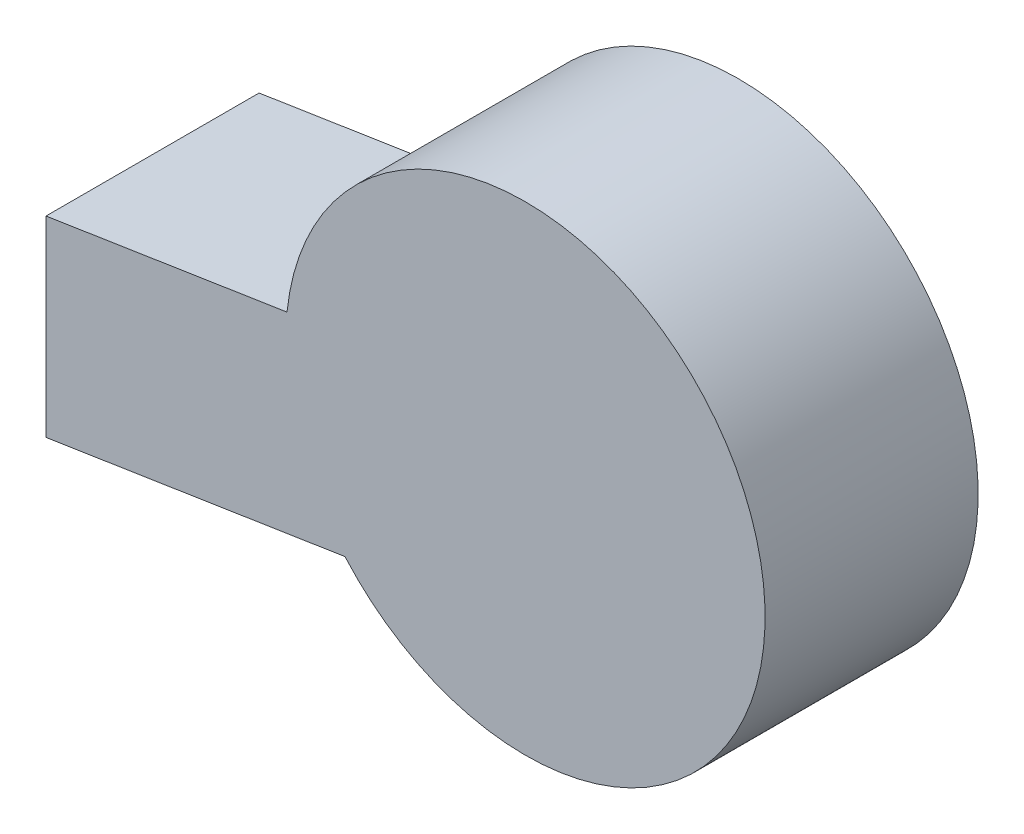
ISO-10303-21;
HEADER;
FILE_DESCRIPTION(('STEP AP214'),'2;1');
FILE_NAME('part.step','',(''),(''),'','','');
FILE_SCHEMA(('AUTOMOTIVE_DESIGN { 1 0 10303 214 1 1 1 1 }'));
ENDSEC;
DATA;
#1=APPLICATION_CONTEXT('core data for automotive mechanical design processes');
#2=APPLICATION_PROTOCOL_DEFINITION('international standard','automotive_design',2000,#1);
#3=PRODUCT_CONTEXT('',#1,'mechanical');
#4=PRODUCT('Part','Part','',(#3));
#5=PRODUCT_RELATED_PRODUCT_CATEGORY('part','',(#4));
#6=PRODUCT_DEFINITION_FORMATION('','',#4);
#7=PRODUCT_DEFINITION_CONTEXT('part definition',#1,'design');
#8=PRODUCT_DEFINITION('design','',#6,#7);
#9=PRODUCT_DEFINITION_SHAPE('','',#8);
#10=(LENGTH_UNIT() NAMED_UNIT(*) SI_UNIT(.MILLI.,.METRE.));
#11=(NAMED_UNIT(*) PLANE_ANGLE_UNIT() SI_UNIT($,.RADIAN.));
#12=(NAMED_UNIT(*) SI_UNIT($,.STERADIAN.) SOLID_ANGLE_UNIT());
#13=UNCERTAINTY_MEASURE_WITH_UNIT(LENGTH_MEASURE(1.E-05),#10,'distance_accuracy_value','');
#14=(GEOMETRIC_REPRESENTATION_CONTEXT(3) GLOBAL_UNCERTAINTY_ASSIGNED_CONTEXT((#13)) GLOBAL_UNIT_ASSIGNED_CONTEXT((#10,
#11,#12)) REPRESENTATION_CONTEXT('',''));
#15=CARTESIAN_POINT('',(0.,0.,0.));
#16=DIRECTION('',(0.,0.,1.));
#17=DIRECTION('',(1.,0.,0.));
#18=AXIS2_PLACEMENT_3D('',#15,#16,#17);
#19=CARTESIAN_POINT('',(-1.87235002467515,19.0016378385421,-61.1080446120955));
#20=DIRECTION('',(0.,0.,-1.));
#21=DIRECTION('',(-1.,0.,0.));
#22=AXIS2_PLACEMENT_3D('',#19,#20,#21);
#23=PLANE('',#22);
#24=CARTESIAN_POINT('',(-1.87235002467515,19.0016378385421,-61.1080446120955));
#25=DIRECTION('',(0.,0.,-1.));
#26=DIRECTION('',(-1.,0.,0.));
#27=AXIS2_PLACEMENT_3D('',#24,#25,#26);
#28=CIRCLE('',#27,4.5);
#29=CARTESIAN_POINT('',(-6.3479103014697,19.4699968982161,-61.1080446120955));
#30=VERTEX_POINT('',#29);
#31=CARTESIAN_POINT('',(-5.2591375478353,16.0385869998006,-61.1080446120955));
#32=VERTEX_POINT('',#31);
#33=EDGE_CURVE('E98',#30,#32,#28,.T.);
#34=ORIENTED_EDGE('',*,*,#33,.F.);
#35=DIRECTION('',(0.988223005254003,0.153020560339931,0.));
#36=VECTOR('',#35,1.);
#37=CARTESIAN_POINT('',(-10.8723500246751,18.7694138334743,-61.1080446120955));
#38=LINE('',#37,#36);
#39=CARTESIAN_POINT('',(-10.8723500246751,18.7694138334743,-61.1080446120955));
#40=VERTEX_POINT('',#39);
#41=EDGE_CURVE('E74',#40,#30,#38,.T.);
#42=ORIENTED_EDGE('',*,*,#41,.F.);
#43=DIRECTION('',(0.,1.,0.));
#44=VECTOR('',#43,1.);
#45=CARTESIAN_POINT('',(-10.8723500246751,18.7694138334743,-61.1080446120955));
#46=LINE('',#45,#44);
#47=CARTESIAN_POINT('',(-10.8723500246751,15.1694138334743,-61.1080446120955));
#48=VERTEX_POINT('',#47);
#49=EDGE_CURVE('E68',#48,#40,#46,.T.);
#50=ORIENTED_EDGE('',*,*,#49,.F.);
#51=DIRECTION('',(-0.988223005254003,-0.153020560339931,0.));
#52=VECTOR('',#51,1.);
#53=CARTESIAN_POINT('',(-5.2591375478353,16.0385869998006,-61.1080446120955));
#54=LINE('',#53,#52);
#55=EDGE_CURVE('E90',#32,#48,#54,.T.);
#56=ORIENTED_EDGE('',*,*,#55,.F.);
#57=EDGE_LOOP('',(#34,#42,#50,#56));
#58=FACE_BOUND('',#57,.T.);
#59=ADVANCED_FACE('F34',(#58),#23,.F.);
#60=CARTESIAN_POINT('',(-10.8723500246751,18.7694138334743,-65.1080446120955));
#61=DIRECTION('',(0.153020560339931,-0.988223005254003,0.));
#62=DIRECTION('',(0.988223005254003,0.153020560339931,0.));
#63=AXIS2_PLACEMENT_3D('',#60,#61,#62);
#64=PLANE('',#63);
#65=ORIENTED_EDGE('',*,*,#41,.T.);
#66=DIRECTION('',(0.,0.,1.));
#67=VECTOR('',#66,1.);
#68=CARTESIAN_POINT('',(-6.3479103014697,19.4699968982161,-65.1080446120955));
#69=LINE('',#68,#67);
#70=CARTESIAN_POINT('',(-6.3479103014697,19.4699968982161,-65.1080446120955));
#71=VERTEX_POINT('',#70);
#72=EDGE_CURVE('E94',#71,#30,#69,.T.);
#73=ORIENTED_EDGE('',*,*,#72,.F.);
#74=DIRECTION('',(0.988223005254003,0.153020560339931,0.));
#75=VECTOR('',#74,1.);
#76=CARTESIAN_POINT('',(-10.8723500246751,18.7694138334743,-65.1080446120955));
#77=LINE('',#76,#75);
#78=CARTESIAN_POINT('',(-10.8723500246751,18.7694138334743,-65.1080446120955));
#79=VERTEX_POINT('',#78);
#80=EDGE_CURVE('E51',#79,#71,#77,.T.);
#81=ORIENTED_EDGE('',*,*,#80,.F.);
#82=DIRECTION('',(0.,0.,1.));
#83=VECTOR('',#82,1.);
#84=CARTESIAN_POINT('',(-10.8723500246751,18.7694138334743,-65.1080446120955));
#85=LINE('',#84,#83);
#86=EDGE_CURVE('E91',#79,#40,#85,.T.);
#87=ORIENTED_EDGE('',*,*,#86,.T.);
#88=EDGE_LOOP('',(#65,#73,#81,#87));
#89=FACE_BOUND('',#88,.T.);
#90=ADVANCED_FACE('F105',(#89),#64,.F.);
#91=CARTESIAN_POINT('',(-1.87235002467515,19.0016378385421,-65.1080446120955));
#92=DIRECTION('',(0.,0.,1.));
#93=DIRECTION('',(1.,0.,0.));
#94=AXIS2_PLACEMENT_3D('',#91,#92,#93);
#95=CYLINDRICAL_SURFACE('',#94,4.5);
#96=ORIENTED_EDGE('',*,*,#33,.T.);
#97=DIRECTION('',(0.,0.,1.));
#98=VECTOR('',#97,1.);
#99=CARTESIAN_POINT('',(-5.2591375478353,16.0385869998006,-65.1080446120955));
#100=LINE('',#99,#98);
#101=CARTESIAN_POINT('',(-5.2591375478353,16.0385869998006,-65.1080446120955));
#102=VERTEX_POINT('',#101);
#103=EDGE_CURVE('E11',#102,#32,#100,.T.);
#104=ORIENTED_EDGE('',*,*,#103,.F.);
#105=CARTESIAN_POINT('',(-1.87235002467515,19.0016378385421,-65.1080446120955));
#106=DIRECTION('',(0.,0.,-1.));
#107=DIRECTION('',(-1.,0.,0.));
#108=AXIS2_PLACEMENT_3D('',#105,#106,#107);
#109=CIRCLE('',#108,4.5);
#110=EDGE_CURVE('E86',#71,#102,#109,.T.);
#111=ORIENTED_EDGE('',*,*,#110,.F.);
#112=ORIENTED_EDGE('',*,*,#72,.T.);
#113=EDGE_LOOP('',(#96,#104,#111,#112));
#114=FACE_BOUND('',#113,.T.);
#115=ADVANCED_FACE('F36',(#114),#95,.T.);
#116=CARTESIAN_POINT('',(-1.87235002467515,19.0016378385421,-65.1080446120955));
#117=DIRECTION('',(0.,0.,-1.));
#118=DIRECTION('',(-1.,0.,0.));
#119=AXIS2_PLACEMENT_3D('',#116,#117,#118);
#120=PLANE('',#119);
#121=ORIENTED_EDGE('',*,*,#110,.T.);
#122=DIRECTION('',(-0.988223005254003,-0.153020560339931,0.));
#123=VECTOR('',#122,1.);
#124=CARTESIAN_POINT('',(-5.2591375478353,16.0385869998006,-65.1080446120955));
#125=LINE('',#124,#123);
#126=CARTESIAN_POINT('',(-10.8723500246751,15.1694138334743,-65.1080446120955));
#127=VERTEX_POINT('',#126);
#128=EDGE_CURVE('E81',#102,#127,#125,.T.);
#129=ORIENTED_EDGE('',*,*,#128,.T.);
#130=DIRECTION('',(0.,1.,0.));
#131=VECTOR('',#130,1.);
#132=CARTESIAN_POINT('',(-10.8723500246751,18.7694138334743,-65.1080446120955));
#133=LINE('',#132,#131);
#134=EDGE_CURVE('E84',#127,#79,#133,.T.);
#135=ORIENTED_EDGE('',*,*,#134,.T.);
#136=ORIENTED_EDGE('',*,*,#80,.T.);
#137=EDGE_LOOP('',(#121,#129,#135,#136));
#138=FACE_BOUND('',#137,.T.);
#139=ADVANCED_FACE('F82',(#138),#120,.T.);
#140=CARTESIAN_POINT('',(-10.8723500246751,18.7694138334743,-65.1080446120955));
#141=DIRECTION('',(1.,0.,0.));
#142=DIRECTION('',(0.,1.,0.));
#143=AXIS2_PLACEMENT_3D('',#140,#141,#142);
#144=PLANE('',#143);
#145=ORIENTED_EDGE('',*,*,#49,.T.);
#146=ORIENTED_EDGE('',*,*,#86,.F.);
#147=ORIENTED_EDGE('',*,*,#134,.F.);
#148=DIRECTION('',(0.,0.,1.));
#149=VECTOR('',#148,1.);
#150=CARTESIAN_POINT('',(-10.8723500246751,15.1694138334743,-65.1080446120955));
#151=LINE('',#150,#149);
#152=EDGE_CURVE('E43',#127,#48,#151,.T.);
#153=ORIENTED_EDGE('',*,*,#152,.T.);
#154=EDGE_LOOP('',(#145,#146,#147,#153));
#155=FACE_BOUND('',#154,.T.);
#156=ADVANCED_FACE('F92',(#155),#144,.F.);
#157=CARTESIAN_POINT('',(-5.2591375478353,16.0385869998006,-65.1080446120955));
#158=DIRECTION('',(-0.153020560339931,0.988223005254003,0.));
#159=DIRECTION('',(-0.988223005254003,-0.153020560339931,0.));
#160=AXIS2_PLACEMENT_3D('',#157,#158,#159);
#161=PLANE('',#160);
#162=ORIENTED_EDGE('',*,*,#55,.T.);
#163=ORIENTED_EDGE('',*,*,#152,.F.);
#164=ORIENTED_EDGE('',*,*,#128,.F.);
#165=ORIENTED_EDGE('',*,*,#103,.T.);
#166=EDGE_LOOP('',(#162,#163,#164,#165));
#167=FACE_BOUND('',#166,.T.);
#168=ADVANCED_FACE('F89',(#167),#161,.F.);
#169=CLOSED_SHELL('',(#59,#90,#115,#139,#156,#168));
#170=MANIFOLD_SOLID_BREP('B2',#169);
#171=ADVANCED_BREP_SHAPE_REPRESENTATION('',(#18,#170),#14);
#172=SHAPE_DEFINITION_REPRESENTATION(#9,#171);
ENDSEC;
END-ISO-10303-21;
